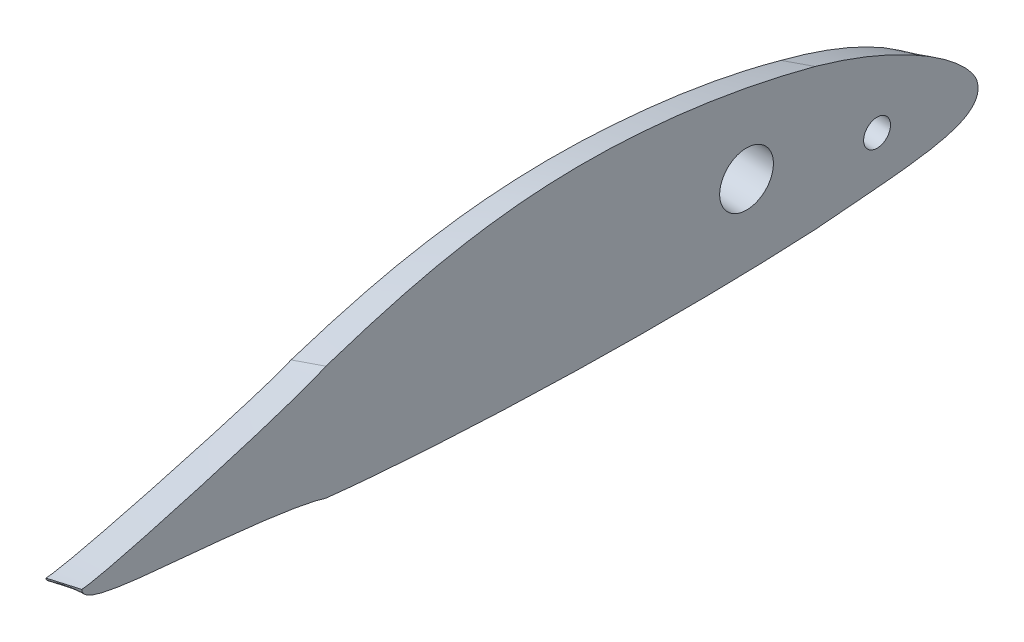
ISO-10303-21;
HEADER;
FILE_DESCRIPTION(('STEP AP214'),'2;1');
FILE_NAME('part.step','',(''),(''),'','','');
FILE_SCHEMA(('AUTOMOTIVE_DESIGN { 1 0 10303 214 1 1 1 1 }'));
ENDSEC;
DATA;
#1=APPLICATION_CONTEXT('core data for automotive mechanical design processes');
#2=APPLICATION_PROTOCOL_DEFINITION('international standard','automotive_design',2000,#1);
#3=PRODUCT_CONTEXT('',#1,'mechanical');
#4=PRODUCT('Part','Part','',(#3));
#5=PRODUCT_RELATED_PRODUCT_CATEGORY('part','',(#4));
#6=PRODUCT_DEFINITION_FORMATION('','',#4);
#7=PRODUCT_DEFINITION_CONTEXT('part definition',#1,'design');
#8=PRODUCT_DEFINITION('design','',#6,#7);
#9=PRODUCT_DEFINITION_SHAPE('','',#8);
#10=(LENGTH_UNIT() NAMED_UNIT(*) SI_UNIT(.MILLI.,.METRE.));
#11=(NAMED_UNIT(*) PLANE_ANGLE_UNIT() SI_UNIT($,.RADIAN.));
#12=(NAMED_UNIT(*) SI_UNIT($,.STERADIAN.) SOLID_ANGLE_UNIT());
#13=UNCERTAINTY_MEASURE_WITH_UNIT(LENGTH_MEASURE(1.E-05),#10,'distance_accuracy_value','');
#14=(GEOMETRIC_REPRESENTATION_CONTEXT(3) GLOBAL_UNCERTAINTY_ASSIGNED_CONTEXT((#13)) GLOBAL_UNIT_ASSIGNED_CONTEXT((#10,
#11,#12)) REPRESENTATION_CONTEXT('',''));
#15=CARTESIAN_POINT('',(0.,0.,0.));
#16=DIRECTION('',(0.,0.,1.));
#17=DIRECTION('',(1.,0.,0.));
#18=AXIS2_PLACEMENT_3D('',#15,#16,#17);
#19=CARTESIAN_POINT('',(-25.,-6.87523890885718,62.5215420335683));
#20=DIRECTION('',(1.,0.,0.));
#21=DIRECTION('',(0.,1.,0.));
#22=AXIS2_PLACEMENT_3D('',#19,#20,#21);
#23=PLANE('',#22);
#24=CARTESIAN_POINT('',(-24.9999999999996,1.64402232390111,15.5000000003833));
#25=DIRECTION('',(1.,0.,0.));
#26=DIRECTION('',(0.,1.,-1.19463882276146E-09));
#27=AXIS2_PLACEMENT_3D('',#24,#25,#26);
#28=ELLIPSE('',#27,2.06282703277914,2.06);
#29=CARTESIAN_POINT('',(-24.9999999999994,3.70684935668025,15.499999997919));
#30=VERTEX_POINT('',#29);
#31=EDGE_CURVE('E450',#30,#30,#28,.T.);
#32=ORIENTED_EDGE('',*,*,#31,.F.);
#33=EDGE_LOOP('',(#32));
#34=FACE_BOUND('',#33,.T.);
#35=CARTESIAN_POINT('',(-24.9999999999992,5.5006500499004,35.5100000003707));
#36=DIRECTION('',(1.,0.,0.));
#37=DIRECTION('',(0.,1.,-1.19463882276146E-09));
#38=AXIS2_PLACEMENT_3D('',#35,#36,#37);
#39=ELLIPSE('',#38,4.12565406555827,4.12);
#40=CARTESIAN_POINT('',(-24.9999999999989,9.62630411545868,35.5099999954421));
#41=VERTEX_POINT('',#40);
#42=EDGE_CURVE('E455',#41,#41,#39,.T.);
#43=ORIENTED_EDGE('',*,*,#42,.F.);
#44=EDGE_LOOP('',(#43));
#45=FACE_BOUND('',#44,.T.);
#46=CARTESIAN_POINT('',(-25.,-6.46727104194618,25.));
#47=CARTESIAN_POINT('',(-25.,-6.59514844057958,27.3335150436203));
#48=CARTESIAN_POINT('',(-25.,-6.76161802996523,31.2464802203529));
#49=CARTESIAN_POINT('',(-25.,-6.9275552680851,36.7458923067943));
#50=CARTESIAN_POINT('',(-25.,-7.01719182140762,42.1938583789044));
#51=CARTESIAN_POINT('',(-25.,-7.0464676153504,47.6734408847487));
#52=CARTESIAN_POINT('',(-25.,-7.03392510715627,56.2754783893999));
#53=CARTESIAN_POINT('',(-25.,-6.83729861053213,64.8634462694053));
#54=CARTESIAN_POINT('',(-25.,-6.43471319589367,75.7992808146063));
#55=CARTESIAN_POINT('',(-25.,-6.00320909266925,83.6044279292734));
#56=CARTESIAN_POINT('',(-25.,-5.40497674782844,92.1925983053741));
#57=CARTESIAN_POINT('',(-25.,-4.98326213169716,96.879208298821));
#58=CARTESIAN_POINT('',(-25.,-4.63536817981115,100.));
#59=B_SPLINE_CURVE_WITH_KNOTS('',3,(#46,#47,#48,#49,#50,#51,#52,#53,#54,#55,#56,#57,#58),
.UNSPECIFIED.,.F.,.F.,(4,1,1,1,1,1,1,1,1,1,4),(0.,0.09375,0.15625,0.21875,0.3125,0.375,0.5625,
0.65625,0.8125,0.875,1.),.UNSPECIFIED.);
#60=CARTESIAN_POINT('',(-25.,-6.46727104194618,25.));
#61=VERTEX_POINT('',#60);
#62=CARTESIAN_POINT('',(-25.,-4.63536817981115,100.));
#63=VERTEX_POINT('',#62);
#64=EDGE_CURVE('E208',#61,#63,#59,.T.);
#65=ORIENTED_EDGE('',*,*,#64,.F.);
#66=CARTESIAN_POINT('',(-25.,0.973605234190688,0.209986371700588));
#67=CARTESIAN_POINT('',(-25.,-5.02445676994703,-1.6030878994067));
#68=CARTESIAN_POINT('',(-25.,-5.12526387130145,10.1105981250928));
#69=CARTESIAN_POINT('',(-25.,-6.46727104194618,25.));
#70=B_SPLINE_CURVE_WITH_KNOTS('',3,(#66,#67,#68,#69),.UNSPECIFIED.,.F.,.F.,(4,4),(0.,1.),.UNSPECIFIED.);
#71=CARTESIAN_POINT('',(-25.,0.973605234190688,0.209986371700588));
#72=VERTEX_POINT('',#71);
#73=EDGE_CURVE('E13',#72,#61,#70,.T.);
#74=ORIENTED_EDGE('',*,*,#73,.F.);
#75=CARTESIAN_POINT('',(-25.,15.1870413329445,25.));
#76=CARTESIAN_POINT('',(-25.,11.2505460282975,10.9514941148119));
#77=CARTESIAN_POINT('',(-25.,4.68854762700634,1.64521557231438));
#78=CARTESIAN_POINT('',(-25.,0.973605234190688,0.209986371700588));
#79=B_SPLINE_CURVE_WITH_KNOTS('',3,(#75,#76,#77,#78),.UNSPECIFIED.,.F.,.F.,(4,4),(0.,1.),.UNSPECIFIED.);
#80=CARTESIAN_POINT('',(-25.,15.1870413329445,25.));
#81=VERTEX_POINT('',#80);
#82=EDGE_CURVE('E156',#81,#72,#79,.T.);
#83=ORIENTED_EDGE('',*,*,#82,.F.);
#84=CARTESIAN_POINT('',(-25.,12.8904914199755,100.));
#85=CARTESIAN_POINT('',(-25.,13.9017198457086,96.9217701257834));
#86=CARTESIAN_POINT('',(-25.,15.3529910442084,92.2723434802091));
#87=CARTESIAN_POINT('',(-25.,17.5611954251861,83.9333529161477));
#88=CARTESIAN_POINT('',(-25.,18.6223359111329,78.4097667119618));
#89=CARTESIAN_POINT('',(-25.,19.4717543578297,72.1307352650264));
#90=CARTESIAN_POINT('',(-25.,20.1811537589977,64.8415809888238));
#91=CARTESIAN_POINT('',(-25.,20.1301122581371,56.8127468678325));
#92=CARTESIAN_POINT('',(-25.,19.6578895305848,50.5374588378752));
#93=CARTESIAN_POINT('',(-25.,19.2942750671242,46.6091887363925));
#94=CARTESIAN_POINT('',(-25.,18.7483182972898,42.1560687549081));
#95=CARTESIAN_POINT('',(-25.,17.8299711544026,36.6680529799144));
#96=CARTESIAN_POINT('',(-25.,16.7438634166486,31.1887225621732));
#97=CARTESIAN_POINT('',(-25.,15.8028667331017,27.3087481175205));
#98=CARTESIAN_POINT('',(-25.,15.1870413329445,25.));
#99=B_SPLINE_CURVE_WITH_KNOTS('',3,(#84,#85,#86,#87,#88,#89,#90,#91,#92,#93,#94,#95,#96,#97,
#98),.UNSPECIFIED.,.F.,.F.,(4,1,1,1,1,1,1,1,1,1,1,1,4),(0.,0.125,0.1875,0.333569716721123,
0.34375,0.4375,0.625,0.666941593847408,0.6875,0.78125,0.84375,0.90625,1.),.UNSPECIFIED.);
#100=CARTESIAN_POINT('',(-25.,12.8904914199755,100.));
#101=VERTEX_POINT('',#100);
#102=EDGE_CURVE('E492',#101,#81,#99,.T.);
#103=ORIENTED_EDGE('',*,*,#102,.F.);
#104=CARTESIAN_POINT('',(-25.,1.96131753405757,137.419360993401));
#105=CARTESIAN_POINT('',(-25.,2.17769518252344,133.342560592737));
#106=CARTESIAN_POINT('',(-25.,10.5653288693064,104.537660694706));
#107=CARTESIAN_POINT('',(-25.,12.8904914199755,100.));
#108=B_SPLINE_CURVE_WITH_KNOTS('',3,(#104,#105,#106,#107),.UNSPECIFIED.,.F.,.F.,(4,4),(0.,1.),.UNSPECIFIED.);
#109=CARTESIAN_POINT('',(-25.,1.96131753405757,137.419360993401));
#110=VERTEX_POINT('',#109);
#111=EDGE_CURVE('E326',#110,#101,#108,.T.);
#112=ORIENTED_EDGE('',*,*,#111,.F.);
#113=CARTESIAN_POINT('',(-25.,-4.63536817981115,100.));
#114=CARTESIAN_POINT('',(-25.,-4.12984221570328,101.448294677224));
#115=CARTESIAN_POINT('',(-25.,-2.96356299158403,107.679495801348));
#116=CARTESIAN_POINT('',(-25.,-1.62946195542815,121.235381181294));
#117=CARTESIAN_POINT('',(-25.,-0.557970232798628,133.508903021512));
#118=CARTESIAN_POINT('',(-25.,0.772229147088015,137.377579987367));
#119=CARTESIAN_POINT('',(-25.,1.96131753405757,137.419360993401));
#120=B_SPLINE_CURVE_WITH_KNOTS('',3,(#113,#114,#115,#116,#117,#118,#119),.UNSPECIFIED.,.F.,.F.,
(4,1,1,1,4),(0.,0.25,0.5,0.75,1.),.UNSPECIFIED.);
#121=EDGE_CURVE('E381',#63,#110,#120,.T.);
#122=ORIENTED_EDGE('',*,*,#121,.F.);
#123=EDGE_LOOP('',(#65,#74,#83,#103,#112,#122));
#124=FACE_BOUND('',#123,.T.);
#125=ADVANCED_FACE('F146',(#34,#45,#124),#23,.T.);
#126=CARTESIAN_POINT('',(-30.9940646990496,-1.37215374510614,118.708278387877));
#127=DIRECTION('',(-0.998629534743233,0.0523359564593458,-6.25186067476628E-11));
#128=DIRECTION('',(-0.0523359564593458,-0.998629534743233,0.));
#129=AXIS2_PLACEMENT_3D('',#126,#127,#128);
#130=PLANE('',#129);
#131=CARTESIAN_POINT('',(-30.8200085103059,1.94903604659932,15.500000000019));
#132=DIRECTION('',(-0.998629534743233,0.0523359564593458,-6.25186067476628E-11));
#133=DIRECTION('',(-0.0523359564593458,-0.998629534743233,0.));
#134=AXIS2_PLACEMENT_3D('',#131,#132,#133);
#135=CIRCLE('',#134,2.06);
#136=CARTESIAN_POINT('',(-30.9278205806121,-0.108140794971745,15.500000000019));
#137=VERTEX_POINT('',#136);
#138=EDGE_CURVE('E150',#137,#137,#135,.T.);
#139=ORIENTED_EDGE('',*,*,#138,.F.);
#140=EDGE_LOOP('',(#139));
#141=FACE_BOUND('',#140,.T.);
#142=CARTESIAN_POINT('',(-30.618444825927,5.79510026747242,35.510000000019));
#143=DIRECTION('',(-0.998629534743233,0.0523359564593458,-6.25186067476628E-11));
#144=DIRECTION('',(-0.0523359564593458,-0.998629534743233,0.));
#145=AXIS2_PLACEMENT_3D('',#142,#143,#144);
#146=CIRCLE('',#145,4.12);
#147=CARTESIAN_POINT('',(-30.8340689665395,1.6807465843303,35.510000000019));
#148=VERTEX_POINT('',#147);
#149=EDGE_CURVE('E458',#148,#148,#146,.T.);
#150=ORIENTED_EDGE('',*,*,#149,.F.);
#151=EDGE_LOOP('',(#150));
#152=FACE_BOUND('',#151,.T.);
#153=CARTESIAN_POINT('',(-31.0430922171337,-2.30765453758993,100.));
#154=CARTESIAN_POINT('',(-31.0405888672822,-2.25988777663054,100.387571370376));
#155=CARTESIAN_POINT('',(-31.0385119866042,-2.22025853223121,100.775962419935));
#156=CARTESIAN_POINT('',(-31.034612804975,-2.14585771397358,101.55323382453));
#157=CARTESIAN_POINT('',(-31.0328238002538,-2.11172147003079,101.942205345746));
#158=CARTESIAN_POINT('',(-31.0277548977915,-2.01500104829763,103.109449228744));
#159=CARTESIAN_POINT('',(-31.0247728156235,-1.95809953014157,103.888077041598));
#160=CARTESIAN_POINT('',(-31.0166047235201,-1.8022430460934,106.224871932533));
#161=CARTESIAN_POINT('',(-31.0122264000537,-1.71869965605326,107.783985053902));
#162=CARTESIAN_POINT('',(-31.0015555983983,-1.51508862635474,112.46421069925));
#163=CARTESIAN_POINT('',(-30.9972648556404,-1.43321637391091,115.586080001787));
#164=CARTESIAN_POINT('',(-30.9924646207543,-1.34162243070374,120.269377580922));
#165=CARTESIAN_POINT('',(-30.9912460999377,-1.3183716666778,121.830656945481));
#166=CARTESIAN_POINT('',(-30.9888938329408,-1.2734877350425,124.953255705198));
#167=CARTESIAN_POINT('',(-30.9877497450413,-1.25165723567519,126.514580261228));
#168=CARTESIAN_POINT('',(-30.9848488152157,-1.19630419458495,128.856133164177));
#169=CARTESIAN_POINT('',(-30.9836803499547,-1.17400854838672,129.636527523433));
#170=CARTESIAN_POINT('',(-30.9804898397006,-1.11312998451311,131.196794003637));
#171=CARTESIAN_POINT('',(-30.9785047780215,-1.07525275050715,131.976670930877));
#172=CARTESIAN_POINT('',(-30.9740763386401,-0.990753092312241,133.144754822464));
#173=CARTESIAN_POINT('',(-30.9723496098295,-0.957805143526188,133.533773789068));
#174=CARTESIAN_POINT('',(-30.9679703995469,-0.874244832958121,134.30995257949));
#175=CARTESIAN_POINT('',(-30.9653447538219,-0.824144527732533,134.697344223543));
#176=CARTESIAN_POINT('',(-30.9599479999923,-0.721168329976943,135.27376736968));
#177=CARTESIAN_POINT('',(-30.9579009353132,-0.682108008959784,135.465171861675));
#178=CARTESIAN_POINT('',(-30.9529733893552,-0.588084830937332,135.843918077059));
#179=CARTESIAN_POINT('',(-30.9501052741016,-0.53335793174868,136.03184311131));
#180=CARTESIAN_POINT('',(-30.9427770696627,-0.393527461320893,136.395083969518));
#181=CARTESIAN_POINT('',(-30.9383638609231,-0.309318422264135,136.574153668947));
#182=CARTESIAN_POINT('',(-30.9287325263111,-0.125541610533196,136.803263628492));
#183=CARTESIAN_POINT('',(-30.9250229121406,-0.0547579556999206,136.871643763586));
#184=CARTESIAN_POINT('',(-30.9161452343838,0.114638226466441,136.971573672684));
#185=CARTESIAN_POINT('',(-30.9111027596621,0.210854375510566,136.999166459119));
#186=CARTESIAN_POINT('',(-30.9059320818603,0.309516785006777,137.));
#187=B_SPLINE_CURVE_WITH_KNOTS('',3,(#153,#154,#155,#156,#157,#158,#159,#160,#161,#162,#163,
#164,#165,#166,#167,#168,#169,#170,#171,#172,#173,#174,#175,#176,#177,#178,#179,#180,#181,#182,
#183,#184,#185,#186),.UNSPECIFIED.,.F.,.F.,(4,2,2,2,2,2,2,2,2,2,2,2,2,2,2,2,4),(0.,
0.0312499999999995,0.0624999999999991,0.124999999999999,0.250000000000001,0.500000000000004,
0.625000000000004,0.750000000000005,0.812500000000005,0.875000000000004,0.906250000000004,
0.937500000000003,0.953125000000002,0.968750000000001,0.984374999999999,0.9921875,1.),.UNSPECIFIED.);
#188=CARTESIAN_POINT('',(-31.0430922171337,-2.30765453758993,100.));
#189=VERTEX_POINT('',#188);
#190=CARTESIAN_POINT('',(-30.9059320818603,0.309516785006768,137.));
#191=VERTEX_POINT('',#190);
#192=EDGE_CURVE('E293',#189,#191,#187,.T.);
#193=ORIENTED_EDGE('',*,*,#192,.T.);
#194=CARTESIAN_POINT('',(-30.9059320818603,0.309516785006768,137.));
#195=CARTESIAN_POINT('',(-30.9055368501271,0.317058255456844,136.796608319332));
#196=CARTESIAN_POINT('',(-30.9043057559796,0.340548930824258,136.596440665329));
#197=CARTESIAN_POINT('',(-30.9014926531859,0.39422612904938,136.197458878768));
#198=CARTESIAN_POINT('',(-30.8998336058368,0.425882637920563,135.998941894195));
#199=CARTESIAN_POINT('',(-30.8944844793777,0.527950049914961,135.404825731228));
#200=CARTESIAN_POINT('',(-30.8904204599391,0.605496159532625,135.010668887805));
#201=CARTESIAN_POINT('',(-30.8775924361851,0.850269431795186,133.830651356376));
#202=CARTESIAN_POINT('',(-30.8681676103681,1.03010581978635,133.047339540177));
#203=CARTESIAN_POINT('',(-30.8388545300934,1.58943270613084,130.701410113554));
#204=CARTESIAN_POINT('',(-30.8178634755727,1.98996588314187,129.143572852775));
#205=CARTESIAN_POINT('',(-30.7531377685201,3.22500593594318,124.481867583631));
#206=CARTESIAN_POINT('',(-30.7074997192882,4.09583178419868,121.387728801896));
#207=CARTESIAN_POINT('',(-30.6131804816859,5.89555003435182,115.216167771568));
#208=CARTESIAN_POINT('',(-30.5644926472979,6.82456924981885,112.138782030795));
#209=CARTESIAN_POINT('',(-30.4878047427749,8.28786162677363,107.54278735239));
#210=CARTESIAN_POINT('',(-30.4616586015277,8.78675971787766,106.014270614859));
#211=CARTESIAN_POINT('',(-30.4204658759082,9.57276373998781,103.735527854569));
#212=CARTESIAN_POINT('',(-30.4064161236507,9.84084898122943,102.978155452533));
#213=CARTESIAN_POINT('',(-30.3842197287804,10.2643814226241,101.849866930561));
#214=CARTESIAN_POINT('',(-30.3766359577625,10.4090883929775,101.475051997465));
#215=CARTESIAN_POINT('',(-30.3606868702697,10.7134151093236,100.730835621208));
#216=CARTESIAN_POINT('',(-30.3524890229688,10.8698393531269,100.360274178101));
#217=CARTESIAN_POINT('',(-30.3428060033805,11.0546023722461,100.));
#218=B_SPLINE_CURVE_WITH_KNOTS('',3,(#194,#195,#196,#197,#198,#199,#200,#201,#202,#203,#204,
#205,#206,#207,#208,#209,#210,#211,#212,#213,#214,#215,#216,#217),.UNSPECIFIED.,.F.,.F.,(4,2,2,
2,2,2,2,2,2,2,2,4),(0.,0.015624999999999,0.0312499999999979,0.062499999999998,0.124999999999998,
0.249999999999998,0.499999999999999,0.75,0.875,0.9375,0.96875,1.),.UNSPECIFIED.);
#219=CARTESIAN_POINT('',(-30.3428060033805,11.0546023722461,100.));
#220=VERTEX_POINT('',#219);
#221=EDGE_CURVE('E284',#191,#220,#218,.T.);
#222=ORIENTED_EDGE('',*,*,#221,.T.);
#223=CARTESIAN_POINT('',(-30.3428060033805,11.0546023722461,100.));
#224=CARTESIAN_POINT('',(-30.2868563612065,12.1221851341158,96.9322533281964));
#225=CARTESIAN_POINT('',(-30.2085072298683,13.6171756068156,92.291985137274));
#226=CARTESIAN_POINT('',(-30.0884420444621,15.9081558012432,83.6971849551633));
#227=CARTESIAN_POINT('',(-30.0125122894403,17.3569818200314,75.7804617281611));
#228=CARTESIAN_POINT('',(-29.9577725554591,18.4014781489858,64.8361954549192));
#229=CARTESIAN_POINT('',(-29.9600220398568,18.3585554197134,56.3085673557943));
#230=CARTESIAN_POINT('',(-29.9955000995849,17.681593705108,47.6635880941875));
#231=CARTESIAN_POINT('',(-30.0292408966741,17.0377809399741,42.1467609712499));
#232=CARTESIAN_POINT('',(-30.0767030750949,16.1321486232158,36.6488807432505));
#233=CARTESIAN_POINT('',(-30.1344380159256,15.0305003235926,31.1744965464025));
#234=CARTESIAN_POINT('',(-30.1861922586034,14.0429705443545,27.302647893024));
#235=CARTESIAN_POINT('',(-30.220952153661,13.3797122355054,25.));
#236=B_SPLINE_CURVE_WITH_KNOTS('',3,(#223,#224,#225,#226,#227,#228,#229,#230,#231,#232,#233,
#234,#235),.UNSPECIFIED.,.F.,.F.,(4,1,1,1,1,1,1,1,1,1,4),(0.,0.125,0.1875,0.34375,0.4375,0.625,
0.6875,0.78125,0.84375,0.90625,1.),.UNSPECIFIED.);
#237=CARTESIAN_POINT('',(-30.2209521536492,13.3797122357301,25.));
#238=VERTEX_POINT('',#237);
#239=EDGE_CURVE('E292',#220,#238,#236,.T.);
#240=ORIENTED_EDGE('',*,*,#239,.T.);
#241=CARTESIAN_POINT('',(-30.2209521536492,13.3797122357301,25.));
#242=CARTESIAN_POINT('',(-30.2360665330655,13.0913126960277,23.9069928281534));
#243=CARTESIAN_POINT('',(-30.2524284480114,12.7791087604684,22.8211768855777));
#244=CARTESIAN_POINT('',(-30.2877608647862,12.1049260866965,20.6645818038492));
#245=CARTESIAN_POINT('',(-30.3067483404637,11.7426234681599,19.5929433795812));
#246=CARTESIAN_POINT('',(-30.3676913101732,10.5797623339953,16.4131151733036));
#247=CARTESIAN_POINT('',(-30.4135499291072,9.70472775894772,14.3366321597632));
#248=CARTESIAN_POINT('',(-30.492321691831,8.20167298988506,11.3047614109054));
#249=CARTESIAN_POINT('',(-30.5203217083668,7.66740084812574,10.3061142655404));
#250=CARTESIAN_POINT('',(-30.5801952829931,6.52494498910318,8.35719655750463));
#251=CARTESIAN_POINT('',(-30.6120326179864,5.91745244970262,7.40606845319041));
#252=CARTESIAN_POINT('',(-30.6639449580099,4.9269059963922,6.03039867920954));
#253=CARTESIAN_POINT('',(-30.6819796517282,4.58278354131777,5.5798333875021));
#254=CARTESIAN_POINT('',(-30.7196749026293,3.86351530833346,4.70815223459664));
#255=CARTESIAN_POINT('',(-30.7393383710088,3.48831398147862,4.28621424960424));
#256=CARTESIAN_POINT('',(-30.781148086248,2.69053709247026,3.48464673590407));
#257=CARTESIAN_POINT('',(-30.8032705125884,2.26841605289779,3.10390672120265));
#258=CARTESIAN_POINT('',(-30.839094100368,1.58486128006569,2.60530784838879));
#259=CARTESIAN_POINT('',(-30.8515476253812,1.34723386784442,2.45039955633066));
#260=CARTESIAN_POINT('',(-30.8778128767139,0.846063018781732,2.18234874389511));
#261=CARTESIAN_POINT('',(-30.8914153320993,0.586512709223841,2.07004208892214));
#262=CARTESIAN_POINT('',(-30.9059320734379,0.309516784545213,2.00000000001898));
#263=B_SPLINE_CURVE_WITH_KNOTS('',3,(#241,#242,#243,#244,#245,#246,#247,#248,#249,#250,#251,
#252,#253,#254,#255,#256,#257,#258,#259,#260,#261,#262),.UNSPECIFIED.,.F.,.F.,(4,2,2,2,2,2,2,2,
2,2,4),(0.,0.125,0.25,0.5,0.625,0.75,0.8125,0.875,0.9375,0.96875,1.),.UNSPECIFIED.);
#264=CARTESIAN_POINT('',(-30.9059320734379,0.309516784545213,2.00000000001898));
#265=VERTEX_POINT('',#264);
#266=EDGE_CURVE('E229',#238,#265,#263,.T.);
#267=ORIENTED_EDGE('',*,*,#266,.T.);
#268=CARTESIAN_POINT('',(-30.9059320734365,0.309516784571313,2.00000000001346));
#269=CARTESIAN_POINT('',(-30.9125017860627,0.184159200503921,2.0265097236331));
#270=CARTESIAN_POINT('',(-30.9187234124713,0.0654434971226595,2.06913990747394));
#271=CARTESIAN_POINT('',(-30.9305749653615,-0.160697602466682,2.18180289730611));
#272=CARTESIAN_POINT('',(-30.9362270269369,-0.26854536142169,2.2525171177577));
#273=CARTESIAN_POINT('',(-30.9517661779802,-0.565050024983014,2.48814850985323));
#274=CARTESIAN_POINT('',(-30.9606563100254,-0.734683848776912,2.68035349366256));
#275=CARTESIAN_POINT('',(-30.9762130822765,-1.03152474480303,3.08882119932063));
#276=CARTESIAN_POINT('',(-30.9829066167109,-1.15924498948343,3.30533768641629));
#277=CARTESIAN_POINT('',(-30.9950377099369,-1.39072003600797,3.75259075133175));
#278=CARTESIAN_POINT('',(-31.0004738819693,-1.49444837691044,3.98435917167242));
#279=CARTESIAN_POINT('',(-31.0153031264911,-1.77740721659793,4.68476750698042));
#280=CARTESIAN_POINT('',(-31.0233416414315,-1.93079121773895,5.16072604035349));
#281=CARTESIAN_POINT('',(-31.0375696873338,-2.20227850412898,6.12166927173714));
#282=CARTESIAN_POINT('',(-31.0437131767197,-2.31950326377605,6.60687873040012));
#283=CARTESIAN_POINT('',(-31.060344861304,-2.63685470761402,8.07128820826406));
#284=CARTESIAN_POINT('',(-31.0690815234247,-2.80356014986264,9.06047441358479));
#285=CARTESIAN_POINT('',(-31.084159506197,-3.09126519655822,11.0428311861838));
#286=CARTESIAN_POINT('',(-31.0904481467589,-3.21125960501708,12.0360067257797));
#287=CARTESIAN_POINT('',(-31.107091196657,-3.52882791014887,15.0190838806501));
#288=CARTESIAN_POINT('',(-31.1152719917049,-3.68492677564576,17.0124573542679));
#289=CARTESIAN_POINT('',(-31.1290043791062,-3.94695633084847,21.0034038595205));
#290=CARTESIAN_POINT('',(-31.1344768488934,-4.05137727206037,23.0011032715973));
#291=CARTESIAN_POINT('',(-31.1391997190062,-4.14149499948288,25.0000000000077));
#292=B_SPLINE_CURVE_WITH_KNOTS('',3,(#268,#269,#270,#271,#272,#273,#274,#275,#276,#277,#278,
#279,#280,#281,#282,#283,#284,#285,#286,#287,#288,#289,#290,#291),.UNSPECIFIED.,.F.,.F.,(4,2,2,
2,2,2,2,2,2,2,2,4),(0.,0.015625,0.0312500000000001,0.0625000000000001,0.0937500000000002,0.125,
0.1875,0.25,0.375,0.5,0.75,1.),.UNSPECIFIED.);
#293=CARTESIAN_POINT('',(-31.1391997190062,-4.14149499948288,25.0000000000077));
#294=VERTEX_POINT('',#293);
#295=EDGE_CURVE('E203',#265,#294,#292,.T.);
#296=ORIENTED_EDGE('',*,*,#295,.T.);
#297=CARTESIAN_POINT('',(-31.1391997190151,-4.14149499965263,25.));
#298=CARTESIAN_POINT('',(-31.1430430044371,-4.21482925103832,27.325305096942));
#299=CARTESIAN_POINT('',(-31.1493019262991,-4.33425658945246,31.2273342313834));
#300=CARTESIAN_POINT('',(-31.1579651030278,-4.4995598415217,36.7200894792421));
#301=CARTESIAN_POINT('',(-31.1645137064708,-4.62451463189443,42.1813315600029));
#302=CARTESIAN_POINT('',(-31.1681694759834,-4.69427086407652,46.6183041293754));
#303=CARTESIAN_POINT('',(-31.1696969766129,-4.72341730758226,50.5350843338448));
#304=CARTESIAN_POINT('',(-31.170381284993,-4.73647468178917,56.7969338044924));
#305=CARTESIAN_POINT('',(-31.1614114671015,-4.56532035162532,64.85619818432));
#306=CARTESIAN_POINT('',(-31.1456188094465,-4.26397848479534,72.142339747397));
#307=CARTESIAN_POINT('',(-31.128822439987,-3.94348465713868,78.3999568276506));
#308=CARTESIAN_POINT('',(-31.10984505844,-3.58137464081677,83.8834932107559));
#309=CARTESIAN_POINT('',(-31.0784467136676,-2.98225852497507,92.219032899259));
#310=CARTESIAN_POINT('',(-31.0581773167011,-2.59549538690137,96.8933170472572));
#311=CARTESIAN_POINT('',(-31.0430922171337,-2.30765453758993,100.));
#312=B_SPLINE_CURVE_WITH_KNOTS('',3,(#297,#298,#299,#300,#301,#302,#303,#304,#305,#306,#307,
#308,#309,#310,#311),.UNSPECIFIED.,.F.,.F.,(4,1,1,1,1,1,1,1,1,1,1,1,4),(0.,0.09375,0.15625,
0.21875,0.3125,0.333058406152592,0.375,0.5625,0.65625,0.666430283278877,0.8125,0.875,1.),.UNSPECIFIED.);
#313=EDGE_CURVE('E212',#294,#189,#312,.T.);
#314=ORIENTED_EDGE('',*,*,#313,.T.);
#315=EDGE_LOOP('',(#193,#222,#240,#267,#296,#314));
#316=FACE_BOUND('',#315,.T.);
#317=ADVANCED_FACE('F227',(#141,#152,#316),#130,.T.);
#318=CARTESIAN_POINT('',(-30.9059320734379,0.309516784545213,2.00000000001898));
#319=CARTESIAN_POINT('',(-25.,0.973605234190688,0.209986371700588));
#320=CARTESIAN_POINT('',(-30.8914153320993,0.586512709223841,2.07004208892214));
#321=CARTESIAN_POINT('',(-25.,1.08969718396618,0.254837284219769));
#322=CARTESIAN_POINT('',(-30.8778128767139,0.846063018781732,2.18234874389511));
#323=CARTESIAN_POINT('',(-25.,1.20856946187494,0.307374768361883));
#324=CARTESIAN_POINT('',(-30.8515476253812,1.34723386784442,2.45039955633066));
#325=CARTESIAN_POINT('',(-25.,1.45154065545896,0.427631911752379));
#326=CARTESIAN_POINT('',(-30.839094100368,1.58486128006569,2.60530784838879));
#327=CARTESIAN_POINT('',(-25.,1.57563957113421,0.495351571000761));
#328=CARTESIAN_POINT('',(-30.8032705125884,2.26841605289779,3.10390672120265));
#329=CARTESIAN_POINT('',(-25.,1.95527524705959,0.720997359195908));
#330=CARTESIAN_POINT('',(-30.781148086248,2.69053709247026,3.48464673590407));
#331=CARTESIAN_POINT('',(-25.,2.21815093620935,0.901410298592676));
#332=CARTESIAN_POINT('',(-30.7393383710088,3.48831398147862,4.28621424960424));
#333=CARTESIAN_POINT('',(-25.,2.76080064357398,1.32067326013609));
#334=CARTESIAN_POINT('',(-30.7196749026293,3.86351530833346,4.70815223459664));
#335=CARTESIAN_POINT('',(-25.,3.04057466178885,1.55952328228274));
#336=CARTESIAN_POINT('',(-30.6819796517282,4.58278354131777,5.5798333875021));
#337=CARTESIAN_POINT('',(-25.,3.61434887928318,2.09413266420912));
#338=CARTESIAN_POINT('',(-30.6639449580099,4.9269059963922,6.03039867920954));
#339=CARTESIAN_POINT('',(-25.,3.90834907856263,2.38989202398885));
#340=CARTESIAN_POINT('',(-30.6120326179864,5.91745244970262,7.40606845319041));
#341=CARTESIAN_POINT('',(-25.,4.80768072599702,3.36024249210249));
#342=CARTESIAN_POINT('',(-30.5801952829931,6.52494498910318,8.35719655750463));
#343=CARTESIAN_POINT('',(-25.,5.43034322374801,4.11790598921083));
#344=CARTESIAN_POINT('',(-30.5203217083668,7.66740084812574,10.3061142655404));
#345=CARTESIAN_POINT('',(-25.,6.70050716750172,5.84253739255835));
#346=CARTESIAN_POINT('',(-30.492321691831,8.20167298988506,11.3047614109054));
#347=CARTESIAN_POINT('',(-25.,7.34800861350445,6.80950529879751));
#348=CARTESIAN_POINT('',(-30.4135499291072,9.70472775894772,14.3366321597632));
#349=CARTESIAN_POINT('',(-25.,9.29570559788367,10.0060326898097));
#350=CARTESIAN_POINT('',(-30.3676913101732,10.5797623339953,16.4131151733036));
#351=CARTESIAN_POINT('',(-25.,10.6010937826312,12.5312158468775));
#352=CARTESIAN_POINT('',(-30.3067483404637,11.7426234681599,19.5929433795812));
#353=CARTESIAN_POINT('',(-25.,12.4412982484684,16.8369061614625));
#354=CARTESIAN_POINT('',(-30.2877608647862,12.1049260866965,20.6645818038492));
#355=CARTESIAN_POINT('',(-25.,13.0350534352001,18.358455529488));
#356=CARTESIAN_POINT('',(-30.2524284480114,12.7791087604684,22.8211768855777));
#357=CARTESIAN_POINT('',(-25.,14.1618940208977,21.5619708309325));
#358=CARTESIAN_POINT('',(-30.2360665330655,13.0913126960277,23.9069928281534));
#359=CARTESIAN_POINT('',(-25.,14.6949794198636,23.2439367643515));
#360=CARTESIAN_POINT('',(-30.2209521536492,13.3797122357301,25.));
#361=CARTESIAN_POINT('',(-25.,15.1870413329445,25.));
#362=B_SPLINE_SURFACE_WITH_KNOTS('',3,1,((#318,#319),(#320,#321),(#322,#323),(#324,#325),(#326,
#327),(#328,#329),(#330,#331),(#332,#333),(#334,#335),(#336,#337),(#338,#339),(#340,#341),(#342,
#343),(#344,#345),(#346,#347),(#348,#349),(#350,#351),(#352,#353),(#354,#355),(#356,#357),(#358,
#359),(#360,#361)),.UNSPECIFIED.,.F.,.F.,.F.,(4,2,2,2,2,2,2,2,2,2,4),(2,2),(0.,0.03125,0.0625,
0.125,0.1875,0.25,0.375,0.5,0.75,0.875,1.),(0.,1.),.UNSPECIFIED.);
#363=DIRECTION('',(0.944981797239758,0.32712291709007,0.));
#364=VECTOR('',#363,1.);
#365=CARTESIAN_POINT('',(-27.6104760768246,14.2833767843373,25.));
#366=LINE('',#365,#364);
#367=EDGE_CURVE('E317',#238,#81,#366,.T.);
#368=DIRECTION('',(-0.951515833977009,-0.106992540236089,0.288392465270621));
#369=VECTOR('',#368,1.);
#370=CARTESIAN_POINT('',(-27.952966036719,0.641561009367951,1.10499318585978));
#371=LINE('',#370,#369);
#372=EDGE_CURVE('E221',#72,#265,#371,.T.);
#373=ORIENTED_EDGE('',*,*,#266,.F.);
#374=ORIENTED_EDGE('',*,*,#367,.T.);
#375=ORIENTED_EDGE('',*,*,#82,.T.);
#376=ORIENTED_EDGE('',*,*,#372,.T.);
#377=EDGE_LOOP('',(#373,#374,#375,#376));
#378=FACE_BOUND('',#377,.T.);
#379=ADVANCED_FACE('F250',(#378),#362,.T.);
#380=CARTESIAN_POINT('',(-30.220952153661,13.3797122355054,25.));
#381=CARTESIAN_POINT('',(-25.,15.1870413329445,25.));
#382=CARTESIAN_POINT('',(-30.1861922586034,14.0429705443545,27.302647893024));
#383=CARTESIAN_POINT('',(-25.,15.8028667331017,27.3087481175205));
#384=CARTESIAN_POINT('',(-30.1344380159256,15.0305003235926,31.1744965464025));
#385=CARTESIAN_POINT('',(-25.,16.7438634166486,31.1887225621732));
#386=CARTESIAN_POINT('',(-30.0767030750949,16.1321486232158,36.6488807432505));
#387=CARTESIAN_POINT('',(-25.,17.8299711544026,36.6680529799144));
#388=CARTESIAN_POINT('',(-30.0292408966741,17.0377809399741,42.1467609712499));
#389=CARTESIAN_POINT('',(-25.,18.7483182972898,42.1560687549081));
#390=CARTESIAN_POINT('',(-30.0019693238482,17.5581535519239,46.6058302769687));
#391=CARTESIAN_POINT('',(-25.,19.2942750671242,46.6091887363925));
#392=CARTESIAN_POINT('',(-29.9837024546077,17.9067061840109,50.5383336959809));
#393=CARTESIAN_POINT('',(-25.,19.6578895305848,50.5374588378752));
#394=CARTESIAN_POINT('',(-29.95988750658,18.3611224681543,56.8185730051909));
#395=CARTESIAN_POINT('',(-25.,20.1301122581371,56.8127468678325));
#396=CARTESIAN_POINT('',(-29.9577725554591,18.4014781489858,64.8361954549192));
#397=CARTESIAN_POINT('',(-25.,20.1811537589977,64.8415809888238));
#398=CARTESIAN_POINT('',(-29.9942361353008,17.7057116094865,72.1264597298686));
#399=CARTESIAN_POINT('',(-25.,19.4717543578297,72.1307352650264));
#400=CARTESIAN_POINT('',(-30.0377647724762,16.8751357446571,78.4133810485541));
#401=CARTESIAN_POINT('',(-25.,18.6223359111329,78.4097667119618));
#402=CARTESIAN_POINT('',(-30.0919978192966,15.8403075761797,83.9517231386666));
#403=CARTESIAN_POINT('',(-25.,17.5611954251861,83.9333529161477));
#404=CARTESIAN_POINT('',(-30.2085072298683,13.6171756068156,92.291985137274));
#405=CARTESIAN_POINT('',(-25.,15.3529910442084,92.2723434802091));
#406=CARTESIAN_POINT('',(-30.2868563612065,12.1221851341158,96.9322533281964));
#407=CARTESIAN_POINT('',(-25.,13.9017198457086,96.9217701257834));
#408=CARTESIAN_POINT('',(-30.3428060033805,11.0546023722461,100.));
#409=CARTESIAN_POINT('',(-25.,12.8904914199755,100.));
#410=B_SPLINE_SURFACE_WITH_KNOTS('',3,1,((#380,#381),(#382,#383),(#384,#385),(#386,#387),(#388,
#389),(#390,#391),(#392,#393),(#394,#395),(#396,#397),(#398,#399),(#400,#401),(#402,#403),(#404,
#405),(#406,#407),(#408,#409)),.UNSPECIFIED.,.F.,.F.,.F.,(4,1,1,1,1,1,1,1,1,1,1,1,4),(2,2),(0.,
0.09375,0.15625,0.21875,0.3125,0.333058406152592,0.375,0.5625,0.65625,0.666430283278877,0.8125,
0.875,1.),(0.,1.),.UNSPECIFIED.);
#411=DIRECTION('',(0.945724712595379,0.324968872334548,0.));
#412=VECTOR('',#411,1.);
#413=CARTESIAN_POINT('',(-27.6714030016903,11.9725468961108,100.));
#414=LINE('',#413,#412);
#415=EDGE_CURVE('E315',#220,#101,#414,.T.);
#416=ORIENTED_EDGE('',*,*,#239,.F.);
#417=ORIENTED_EDGE('',*,*,#415,.T.);
#418=ORIENTED_EDGE('',*,*,#102,.T.);
#419=ORIENTED_EDGE('',*,*,#367,.F.);
#420=EDGE_LOOP('',(#416,#417,#418,#419));
#421=FACE_BOUND('',#420,.T.);
#422=ADVANCED_FACE('F313',(#421),#410,.T.);
#423=CARTESIAN_POINT('',(-31.1391997190062,-4.14149499948288,25.0000000000077));
#424=CARTESIAN_POINT('',(-25.,-6.46727104194618,25.));
#425=CARTESIAN_POINT('',(-31.1344768488934,-4.05137727206037,23.0011032715973));
#426=CARTESIAN_POINT('',(-25.,-6.25625812941599,22.6588381014781));
#427=CARTESIAN_POINT('',(-31.1290043791062,-3.94695633084847,21.0034038595205));
#428=CARTESIAN_POINT('',(-25.,-6.07031444186612,20.3155097300161));
#429=CARTESIAN_POINT('',(-31.1218191333373,-3.80985367725744,18.9152067636369));
#430=CARTESIAN_POINT('',(-25.0000000000001,-5.86773446867523,17.8638320698492));
#431=CARTESIAN_POINT('',(-31.1150173339879,-3.68006761702593,16.9559751198696));
#432=CARTESIAN_POINT('',(-25.0000000000001,-5.67730776307613,15.5634791363704));
#433=CARTESIAN_POINT('',(-31.1067262665243,-3.52186462850043,14.9627777815527));
#434=CARTESIAN_POINT('',(-25.0000000000001,-5.47437307578013,13.2213166012225));
#435=CARTESIAN_POINT('',(-31.0961968104341,-3.32095064069191,13.0663892209089));
#436=CARTESIAN_POINT('',(-25.0000000000001,-5.21528004238924,10.9943218845444));
#437=CARTESIAN_POINT('',(-31.0904481467589,-3.21125960501708,12.0360067257797));
#438=CARTESIAN_POINT('',(-25.0000000000001,-5.07378094992987,9.78433085284814));
#439=CARTESIAN_POINT('',(-31.084159506197,-3.09126519655822,11.0428311861838));
#440=CARTESIAN_POINT('',(-25.0000000000001,-4.91811103453904,8.61861646689018));
#441=CARTESIAN_POINT('',(-31.0725834950473,-2.87038174824309,9.52089125238124));
#442=CARTESIAN_POINT('',(-25.0000000000001,-4.60379405286719,6.84155073261075));
#443=CARTESIAN_POINT('',(-31.0644031684774,-2.71429182064151,8.53077964989564));
#444=CARTESIAN_POINT('',(-25.0000000000001,-4.3728360369825,5.68870802416582));
#445=CARTESIAN_POINT('',(-31.0544075118692,-2.52356333257868,7.54850828530049));
#446=CARTESIAN_POINT('',(-25.0000000000001,-4.07682722635806,4.54768001673797));
#447=CARTESIAN_POINT('',(-31.0439943433472,-2.32486824257679,6.63163527698877));
#448=CARTESIAN_POINT('',(-25.,-3.74233456632578,3.49605967780861));
#449=CARTESIAN_POINT('',(-31.0378812632629,-2.20822372696606,6.14627736957497));
#450=CARTESIAN_POINT('',(-25.,-3.53352034532391,2.94705565487789));
#451=CARTESIAN_POINT('',(-31.0308164623219,-2.07341929567234,5.66556546734031));
#452=CARTESIAN_POINT('',(-25.,-3.27586815181277,2.41818674195317));
#453=CARTESIAN_POINT('',(-31.0244316913616,-1.95159060927774,5.23434655784388));
#454=CARTESIAN_POINT('',(-25.,-3.04228475054927,1.94458795304574));
#455=CARTESIAN_POINT('',(-31.0165348321953,-1.80090956131498,4.75769650504503));
#456=CARTESIAN_POINT('',(-25.,-2.73843652100531,1.43654571986584));
#457=CARTESIAN_POINT('',(-31.0069317760344,-1.61767233540639,4.28937557524381));
#458=CARTESIAN_POINT('',(-25.,-2.3391303410627,1.00297208898152));
#459=CARTESIAN_POINT('',(-31.0004738819693,-1.49444837691044,3.98435917167242));
#460=CARTESIAN_POINT('',(-25.,-2.06886907387399,0.729076317998671));
#461=CARTESIAN_POINT('',(-30.9950377099369,-1.39072003600797,3.75259075133175));
#462=CARTESIAN_POINT('',(-25.,-1.83846302576973,0.542720441440922));
#463=CARTESIAN_POINT('',(-30.9860871305846,-1.21993280905249,3.4225978996135));
#464=CARTESIAN_POINT('',(-25.,-1.46529622927422,0.324612265892552));
#465=CARTESIAN_POINT('',(-30.9830600244287,-1.16217218308907,3.31784012816459));
#466=CARTESIAN_POINT('',(-25.,-1.33992831008757,0.263031109922589));
#467=CARTESIAN_POINT('',(-30.9762937231892,-1.03306346505821,3.10214750304159));
#468=CARTESIAN_POINT('',(-25.,-1.06590092493633,0.155349714195712));
#469=CARTESIAN_POINT('',(-30.9725133499913,-0.960929647769403,2.99167886582795));
#470=CARTESIAN_POINT('',(-25.,-0.91836257176115,0.112998141805439));
#471=CARTESIAN_POINT('',(-30.9606563100254,-0.734683848776912,2.68035349366256));
#472=CARTESIAN_POINT('',(-25.,-0.482423497144136,0.0265375401856025));
#473=CARTESIAN_POINT('',(-30.9517661779802,-0.565050024983014,2.48814850985323));
#474=CARTESIAN_POINT('',(-25.,-0.187645110766564,0.0156822145397658));
#475=CARTESIAN_POINT('',(-30.9362270269369,-0.26854536142169,2.2525171177577));
#476=CARTESIAN_POINT('',(-25.,0.252822402461409,0.0525722597833141));
#477=CARTESIAN_POINT('',(-30.9305749653615,-0.160697602466682,2.18180289730611));
#478=CARTESIAN_POINT('',(-25.,0.399361562481004,0.0737311138165477));
#479=CARTESIAN_POINT('',(-30.9187234124713,0.0654434971226595,2.06913990747394));
#480=CARTESIAN_POINT('',(-25.,0.689390804330586,0.131169325392137));
#481=CARTESIAN_POINT('',(-30.9125017860627,0.184159200503921,2.0265097236331));
#482=CARTESIAN_POINT('',(-25.,0.832880886160575,0.167448682934493));
#483=CARTESIAN_POINT('',(-30.9059320734365,0.309516784571313,2.00000000001346));
#484=CARTESIAN_POINT('',(-25.,0.973605234190688,0.209986371700588));
#485=B_SPLINE_SURFACE_WITH_KNOTS('',3,1,((#423,#424),(#425,#426),(#427,#428),(#429,#430),(#431,
#432),(#433,#434),(#435,#436),(#437,#438),(#439,#440),(#441,#442),(#443,#444),(#445,#446),(#447,
#448),(#449,#450),(#451,#452),(#453,#454),(#455,#456),(#457,#458),(#459,#460),(#461,#462),(#463,
#464),(#465,#466),(#467,#468),(#469,#470),(#471,#472),(#473,#474),(#475,#476),(#477,#478),(#479,
#480),(#481,#482),(#483,#484)),.UNSPECIFIED.,.F.,.F.,.F.,(4,2,1,1,2,2,1,2,1,2,1,2,2,2,2,2,2,4),
(2,2),(0.,0.25,0.261616773506643,0.495471524666193,0.5,0.625,0.691935674097553,0.75,
0.809330222314497,0.8125,0.865423404436652,0.875,0.90625,0.921113833197072,0.9375,0.96875,
0.984375,1.),(0.,1.),.UNSPECIFIED.);
#486=DIRECTION('',(0.935143216711032,-0.354269903095569,0.));
#487=VECTOR('',#486,1.);
#488=CARTESIAN_POINT('',(-28.0695998595076,-5.30438302079941,25.));
#489=LINE('',#488,#487);
#490=EDGE_CURVE('E164',#294,#61,#489,.T.);
#491=ORIENTED_EDGE('',*,*,#295,.F.);
#492=ORIENTED_EDGE('',*,*,#372,.F.);
#493=ORIENTED_EDGE('',*,*,#73,.T.);
#494=ORIENTED_EDGE('',*,*,#490,.F.);
#495=EDGE_LOOP('',(#491,#492,#493,#494));
#496=FACE_BOUND('',#495,.T.);
#497=ADVANCED_FACE('F200',(#496),#485,.T.);
#498=CARTESIAN_POINT('',(-30.3428060033805,11.0546023722461,100.));
#499=CARTESIAN_POINT('',(-25.,12.8904914199755,100.));
#500=CARTESIAN_POINT('',(-30.3524890229688,10.8698393531269,100.360274178101));
#501=CARTESIAN_POINT('',(-25.,12.8178300902671,100.14180189671));
#502=CARTESIAN_POINT('',(-30.3606868702697,10.7134151093236,100.730835621208));
#503=CARTESIAN_POINT('',(-25.,12.7392483785898,100.307302269204));
#504=CARTESIAN_POINT('',(-30.3766359577625,10.4090883929775,101.475051997465));
#505=CARTESIAN_POINT('',(-25.,12.5711129490596,100.682709527608));
#506=CARTESIAN_POINT('',(-30.3842197287804,10.2643814226241,101.849866930561));
#507=CARTESIAN_POINT('',(-25.,12.4815592312068,100.892616413518));
#508=CARTESIAN_POINT('',(-30.4064161236507,9.84084898122943,102.978155452533));
#509=CARTESIAN_POINT('',(-25.,12.1977432050279,101.584461184141));
#510=CARTESIAN_POINT('',(-30.4204658759082,9.57276373998781,103.735527854569));
#511=CARTESIAN_POINT('',(-25.,11.9883260240816,102.12852318175));
#512=CARTESIAN_POINT('',(-30.4616586015277,8.78675971787766,106.014270614859));
#513=CARTESIAN_POINT('',(-25.,11.3098800839071,103.973320368313));
#514=CARTESIAN_POINT('',(-30.4878047427749,8.28786162677363,107.54278735239));
#515=CARTESIAN_POINT('',(-25.,10.7906569273433,105.486666751008));
#516=CARTESIAN_POINT('',(-30.5644926472979,6.82456924981885,112.138782030795));
#517=CARTESIAN_POINT('',(-25.,9.11561061347177,110.590068611348));
#518=CARTESIAN_POINT('',(-30.6131804816859,5.89555003435182,115.216167771568));
#519=CARTESIAN_POINT('',(-25.,7.84241061198411,114.743486801252));
#520=CARTESIAN_POINT('',(-30.7074997192882,4.09583178419868,121.387728801896));
#521=CARTESIAN_POINT('',(-25.,5.4278096653965,123.021519412681));
#522=CARTESIAN_POINT('',(-30.7531377685201,3.22500593594318,124.481867583631));
#523=CARTESIAN_POINT('',(-25.,4.28640872029655,127.146133834206));
#524=CARTESIAN_POINT('',(-30.8178634755727,1.98996588314187,129.143572852775));
#525=CARTESIAN_POINT('',(-25.,3.00675957558812,132.163124389414));
#526=CARTESIAN_POINT('',(-30.8388545300934,1.58943270613084,130.701410113554));
#527=CARTESIAN_POINT('',(-25.,2.6522852395089,133.640466061637));
#528=CARTESIAN_POINT('',(-30.8681676103681,1.03010581978635,133.047339540177));
#529=CARTESIAN_POINT('',(-25.,2.27038717620678,135.42045476935));
#530=CARTESIAN_POINT('',(-30.8775924361851,0.850269431795186,133.830651356376));
#531=CARTESIAN_POINT('',(-25.,2.16805672857552,135.941113705152));
#532=CARTESIAN_POINT('',(-30.8904204599391,0.605496159532625,135.010668887805));
#533=CARTESIAN_POINT('',(-25.,2.05722696390549,136.59515352978));
#534=CARTESIAN_POINT('',(-30.8944844793777,0.527950049914961,135.404825731228));
#535=CARTESIAN_POINT('',(-25.,2.02739469347829,136.792008708144));
#536=CARTESIAN_POINT('',(-30.8998336058368,0.425882637920563,135.998941894195));
#537=CARTESIAN_POINT('',(-25.,1.99396433285328,137.053311502306));
#538=CARTESIAN_POINT('',(-30.9014926531859,0.39422612904938,136.197458878768));
#539=CARTESIAN_POINT('',(-25.,1.98470722014757,137.134749104797));
#540=CARTESIAN_POINT('',(-30.9043057559796,0.340548930824258,136.596440665329));
#541=CARTESIAN_POINT('',(-25.,1.97007427112836,137.285923847214));
#542=CARTESIAN_POINT('',(-30.9055368501271,0.317058255456844,136.796608319332));
#543=CARTESIAN_POINT('',(-25.,1.96469843481485,137.35566098714));
#544=CARTESIAN_POINT('',(-30.9059320818603,0.309516785006768,137.));
#545=CARTESIAN_POINT('',(-25.,1.96131753405757,137.419360993401));
#546=B_SPLINE_SURFACE_WITH_KNOTS('',3,1,((#498,#499),(#500,#501),(#502,#503),(#504,#505),(#506,
#507),(#508,#509),(#510,#511),(#512,#513),(#514,#515),(#516,#517),(#518,#519),(#520,#521),(#522,
#523),(#524,#525),(#526,#527),(#528,#529),(#530,#531),(#532,#533),(#534,#535),(#536,#537),(#538,
#539),(#540,#541),(#542,#543),(#544,#545)),.UNSPECIFIED.,.F.,.F.,.F.,(4,2,2,2,2,2,2,2,2,2,2,4),
(2,2),(0.,0.0312499999999998,0.0624999999999996,0.125,0.25,0.500000000000001,0.750000000000002,
0.875000000000002,0.937500000000002,0.968750000000002,0.984375000000001,1.),(0.,1.),.UNSPECIFIED.);
#547=DIRECTION('',(0.960798928602013,0.268721070265358,0.0682232012783338));
#548=VECTOR('',#547,1.);
#549=CARTESIAN_POINT('',(-27.9529660409301,1.13541715953217,137.2096804967));
#550=LINE('',#549,#548);
#551=EDGE_CURVE('E329',#191,#110,#550,.T.);
#552=ORIENTED_EDGE('',*,*,#221,.F.);
#553=ORIENTED_EDGE('',*,*,#551,.T.);
#554=ORIENTED_EDGE('',*,*,#111,.T.);
#555=ORIENTED_EDGE('',*,*,#415,.F.);
#556=EDGE_LOOP('',(#552,#553,#554,#555));
#557=FACE_BOUND('',#556,.T.);
#558=ADVANCED_FACE('F322',(#557),#546,.T.);
#559=CARTESIAN_POINT('',(-30.9059320818603,0.309516785006777,137.));
#560=CARTESIAN_POINT('',(-25.,1.96131753405757,137.419360993401));
#561=CARTESIAN_POINT('',(-30.9111027596621,0.210854375510566,136.999166459119));
#562=CARTESIAN_POINT('',(-25.,1.92415852196477,137.418055336962));
#563=CARTESIAN_POINT('',(-30.9161452343838,0.114638226466441,136.971573672684));
#564=CARTESIAN_POINT('',(-25.,1.88751121758391,137.414901479863));
#565=CARTESIAN_POINT('',(-30.9250229121406,-0.0547579556999206,136.871643763586));
#566=CARTESIAN_POINT('',(-25.,1.81521743996837,137.404947055488));
#567=CARTESIAN_POINT('',(-30.9287325263111,-0.125541610533196,136.803263628492));
#568=CARTESIAN_POINT('',(-25.,1.77957096673369,137.398146488213));
#569=CARTESIAN_POINT('',(-30.9383638609231,-0.309318422264135,136.574153668947));
#570=CARTESIAN_POINT('',(-25.,1.67409891733238,137.372349257844));
#571=CARTESIAN_POINT('',(-30.9427770696627,-0.393527461320893,136.395083969518));
#572=CARTESIAN_POINT('',(-25.,1.60574071146847,137.347957066207));
#573=CARTESIAN_POINT('',(-30.9501052741016,-0.53335793174868,136.03184311131));
#574=CARTESIAN_POINT('',(-25.,1.47275661299298,137.285182135989));
#575=CARTESIAN_POINT('',(-30.9529733893552,-0.588084830937332,135.843918077059));
#576=CARTESIAN_POINT('',(-25.,1.40813072038139,137.246799397409));
#577=CARTESIAN_POINT('',(-30.9579009353132,-0.682108008959784,135.465171861675));
#578=CARTESIAN_POINT('',(-25.,1.28243057418896,137.156440902476));
#579=CARTESIAN_POINT('',(-30.9599479999923,-0.721168329976943,135.27376736968));
#580=CARTESIAN_POINT('',(-25.,1.22135632060811,137.104465146125));
#581=CARTESIAN_POINT('',(-30.9653447538219,-0.824144527732533,134.697344223543));
#582=CARTESIAN_POINT('',(-25.,1.04319000707925,136.928744644171));
#583=CARTESIAN_POINT('',(-30.9679703995469,-0.874244832958121,134.30995257949));
#584=CARTESIAN_POINT('',(-25.,0.931154394344958,136.785206665671));
#585=CARTESIAN_POINT('',(-30.9723496098295,-0.957805143526188,133.533773789068));
#586=CARTESIAN_POINT('',(-25.,0.719121634340162,136.448528987655));
#587=CARTESIAN_POINT('',(-30.9740763386401,-0.990753092312241,133.144754822464));
#588=CARTESIAN_POINT('',(-25.,0.619124487069661,136.255389288139));
#589=CARTESIAN_POINT('',(-30.9785047780215,-1.07525275050715,131.976670930877));
#590=CARTESIAN_POINT('',(-25.,0.335022652794712,135.606337958133));
#591=CARTESIAN_POINT('',(-30.9804898397006,-1.11312998451311,131.196794003637));
#592=CARTESIAN_POINT('',(-25.,0.166807573326818,135.080794096188));
#593=CARTESIAN_POINT('',(-30.9836803499547,-1.17400854838672,129.636527523433));
#594=CARTESIAN_POINT('',(-25.,-0.138813449026906,133.869462288779));
#595=CARTESIAN_POINT('',(-30.9848488152157,-1.19630419458495,128.856133164177));
#596=CARTESIAN_POINT('',(-25.,-0.276219391912722,133.183674343315));
#597=CARTESIAN_POINT('',(-30.9877497450413,-1.25165723567519,126.514580261228));
#598=CARTESIAN_POINT('',(-25.,-0.65956824097016,130.92410718219));
#599=CARTESIAN_POINT('',(-30.9888938329408,-1.2734877350425,124.953255705198));
#600=CARTESIAN_POINT('',(-25.,-0.876642167541769,129.148124641796));
#601=CARTESIAN_POINT('',(-30.9912460999377,-1.3183716666778,121.830656945481));
#602=CARTESIAN_POINT('',(-25.,-1.28324010261523,125.273123313878));
#603=CARTESIAN_POINT('',(-30.9924646207543,-1.34162243070374,120.269377580922));
#604=CARTESIAN_POINT('',(-25.,-1.47276411111709,123.174104526353));
#605=CARTESIAN_POINT('',(-30.9972648556404,-1.43321637391091,115.586080001787));
#606=CARTESIAN_POINT('',(-25.,-2.07416230081345,116.716752721312));
#607=CARTESIAN_POINT('',(-31.0015555983983,-1.51508862635474,112.46421069925));
#608=CARTESIAN_POINT('',(-25.,-2.51886264619874,112.19812426133));
#609=CARTESIAN_POINT('',(-31.0122264000537,-1.71869965605326,107.783985053902));
#610=CARTESIAN_POINT('',(-25.,-3.28974261428243,106.472452494797));
#611=CARTESIAN_POINT('',(-31.0166047235201,-1.8022430460934,106.224871932533));
#612=CARTESIAN_POINT('',(-25.,-3.56400751197795,104.739273726526));
#613=CARTESIAN_POINT('',(-31.0247728156235,-1.95809953014157,103.888077041598));
#614=CARTESIAN_POINT('',(-25.,-3.973830980781,102.583659292956));
#615=CARTESIAN_POINT('',(-31.0277548977915,-2.01500104829763,103.109449228744));
#616=CARTESIAN_POINT('',(-25.,-4.11017649075864,101.939146768239));
#617=CARTESIAN_POINT('',(-31.0328238002538,-2.11172147003079,101.942205345746));
#618=CARTESIAN_POINT('',(-25.,-4.31085988125984,101.106052159371));
#619=CARTESIAN_POINT('',(-31.034612804975,-2.14585771397358,101.55323382453));
#620=CARTESIAN_POINT('',(-25.,-4.37711519901602,100.850632986115));
#621=CARTESIAN_POINT('',(-31.0385119866042,-2.22025853223121,100.775962419935));
#622=CARTESIAN_POINT('',(-25.,-4.50777397553494,100.388125323757));
#623=CARTESIAN_POINT('',(-31.0405888672822,-2.25988777663054,100.387571370376));
#624=CARTESIAN_POINT('',(-25.,-4.57217743429767,100.181036834653));
#625=CARTESIAN_POINT('',(-31.0430922171337,-2.30765453758993,100.));
#626=CARTESIAN_POINT('',(-25.,-4.63536817981115,100.));
#627=B_SPLINE_SURFACE_WITH_KNOTS('',3,1,((#559,#560),(#561,#562),(#563,#564),(#565,#566),(#567,
#568),(#569,#570),(#571,#572),(#573,#574),(#575,#576),(#577,#578),(#579,#580),(#581,#582),(#583,
#584),(#585,#586),(#587,#588),(#589,#590),(#591,#592),(#593,#594),(#595,#596),(#597,#598),(#599,
#600),(#601,#602),(#603,#604),(#605,#606),(#607,#608),(#609,#610),(#611,#612),(#613,#614),(#615,
#616),(#617,#618),(#619,#620),(#621,#622),(#623,#624),(#625,#626)),.UNSPECIFIED.,.F.,.F.,.F.,(4,
2,2,2,2,2,2,2,2,2,2,2,2,2,2,2,4),(2,2),(0.,0.00781250000000033,0.0156250000000006,
0.0312499999999993,0.0468749999999981,0.0624999999999969,0.0937499999999964,0.124999999999996,
0.187499999999995,0.249999999999995,0.374999999999996,0.499999999999996,0.749999999999999,
0.875000000000001,0.937500000000001,0.96875,1.),(0.,1.),.UNSPECIFIED.);
#628=DIRECTION('',(0.933167128258583,-0.359442778113053,0.));
#629=VECTOR('',#628,1.);
#630=CARTESIAN_POINT('',(-28.0215461085668,-3.47151135870054,100.));
#631=LINE('',#630,#629);
#632=EDGE_CURVE('E209',#189,#63,#631,.T.);
#633=ORIENTED_EDGE('',*,*,#192,.F.);
#634=ORIENTED_EDGE('',*,*,#632,.T.);
#635=ORIENTED_EDGE('',*,*,#121,.T.);
#636=ORIENTED_EDGE('',*,*,#551,.F.);
#637=EDGE_LOOP('',(#633,#634,#635,#636));
#638=FACE_BOUND('',#637,.T.);
#639=ADVANCED_FACE('F355',(#638),#627,.T.);
#640=CARTESIAN_POINT('',(-31.0430922171337,-2.30765453758993,100.));
#641=CARTESIAN_POINT('',(-25.,-4.63536817981115,100.));
#642=CARTESIAN_POINT('',(-31.0581773167011,-2.59549538690137,96.8933170472572));
#643=CARTESIAN_POINT('',(-25.,-4.98326213169716,96.879208298821));
#644=CARTESIAN_POINT('',(-31.0784467136676,-2.98225852497507,92.219032899259));
#645=CARTESIAN_POINT('',(-25.,-5.40497674782844,92.1925983053741));
#646=CARTESIAN_POINT('',(-31.10984505844,-3.58137464081677,83.8834932107559));
#647=CARTESIAN_POINT('',(-25.,-5.98549222070687,83.8587697686217));
#648=CARTESIAN_POINT('',(-31.128822439987,-3.94348465713868,78.3999568276506));
#649=CARTESIAN_POINT('',(-25.,-6.29120489610451,78.3950924967204));
#650=CARTESIAN_POINT('',(-31.1456188094465,-4.26397848479534,72.142339747397));
#651=CARTESIAN_POINT('',(-25.,-6.5691258529732,72.1480939480313));
#652=CARTESIAN_POINT('',(-31.1614114671015,-4.56532035162532,64.85619818432));
#653=CARTESIAN_POINT('',(-25.,-6.83729861053213,64.8634462694053));
#654=CARTESIAN_POINT('',(-31.170381284993,-4.73647468178917,56.7969338044924));
#655=CARTESIAN_POINT('',(-25.,-7.02216560932948,56.789092736171));
#656=CARTESIAN_POINT('',(-31.1696969766129,-4.72341730758226,50.5350843338448));
#657=CARTESIAN_POINT('',(-25.,-7.04229681063527,50.5339069118658));
#658=CARTESIAN_POINT('',(-31.1681694759834,-4.69427086407652,46.6183041293754));
#659=CARTESIAN_POINT('',(-25.,-7.04085447953733,46.6228240897156));
#660=CARTESIAN_POINT('',(-31.1645137064708,-4.62451463189443,42.1813315600029));
#661=CARTESIAN_POINT('',(-25.,-7.01719182140762,42.1938583789044));
#662=CARTESIAN_POINT('',(-31.1579651030278,-4.4995598415217,36.7200894792421));
#663=CARTESIAN_POINT('',(-25.,-6.9275552680851,36.7458923067943));
#664=CARTESIAN_POINT('',(-31.1493019262991,-4.33425658945246,31.2273342313834));
#665=CARTESIAN_POINT('',(-25.,-6.76161802996523,31.2464802203529));
#666=CARTESIAN_POINT('',(-31.1430430044371,-4.21482925103832,27.325305096942));
#667=CARTESIAN_POINT('',(-25.,-6.59514844057958,27.3335150436203));
#668=CARTESIAN_POINT('',(-31.1391997190151,-4.14149499965263,25.));
#669=CARTESIAN_POINT('',(-25.,-6.46727104194618,25.));
#670=B_SPLINE_SURFACE_WITH_KNOTS('',3,1,((#640,#641),(#642,#643),(#644,#645),(#646,#647),(#648,
#649),(#650,#651),(#652,#653),(#654,#655),(#656,#657),(#658,#659),(#660,#661),(#662,#663),(#664,
#665),(#666,#667),(#668,#669)),.UNSPECIFIED.,.F.,.F.,.F.,(4,1,1,1,1,1,1,1,1,1,1,1,4),(2,2),(0.,
0.125,0.1875,0.333569716721123,0.34375,0.4375,0.625,0.666941593847408,0.6875,0.78125,0.84375,
0.90625,1.),(0.,1.),.UNSPECIFIED.);
#671=ORIENTED_EDGE('',*,*,#313,.F.);
#672=ORIENTED_EDGE('',*,*,#490,.T.);
#673=ORIENTED_EDGE('',*,*,#64,.T.);
#674=ORIENTED_EDGE('',*,*,#632,.F.);
#675=EDGE_LOOP('',(#671,#672,#673,#674));
#676=FACE_BOUND('',#675,.T.);
#677=ADVANCED_FACE('F214',(#676),#670,.T.);
#678=CARTESIAN_POINT('',(-24.2362022803197,5.46062110742458,35.5100000004185));
#679=DIRECTION('',(-0.998629534743233,0.0523359564593458,-6.25186067476628E-11));
#680=DIRECTION('',(-0.0523359564593459,-0.998629534743233,0.));
#681=AXIS2_PLACEMENT_3D('',#678,#679,#680);
#682=CYLINDRICAL_SURFACE('',#681,4.12);
#683=ORIENTED_EDGE('',*,*,#42,.T.);
#684=EDGE_LOOP('',(#683));
#685=FACE_BOUND('',#684,.T.);
#686=ORIENTED_EDGE('',*,*,#149,.T.);
#687=EDGE_LOOP('',(#686));
#688=FACE_BOUND('',#687,.T.);
#689=ADVANCED_FACE('F252',(#685,#688),#682,.F.);
#690=CARTESIAN_POINT('',(-24.4377659646986,1.61455688655147,15.5000000004185));
#691=DIRECTION('',(-0.998629534743233,0.0523359564593458,-6.25186067476628E-11));
#692=DIRECTION('',(-0.0523359564593459,-0.998629534743233,0.));
#693=AXIS2_PLACEMENT_3D('',#690,#691,#692);
#694=CYLINDRICAL_SURFACE('',#693,2.06);
#695=ORIENTED_EDGE('',*,*,#31,.T.);
#696=EDGE_LOOP('',(#695));
#697=FACE_BOUND('',#696,.T.);
#698=ORIENTED_EDGE('',*,*,#138,.T.);
#699=EDGE_LOOP('',(#698));
#700=FACE_BOUND('',#699,.T.);
#701=ADVANCED_FACE('F586',(#697,#700),#694,.F.);
#702=CLOSED_SHELL('',(#125,#317,#379,#422,#497,#558,#639,#677,#689,#701));
#703=MANIFOLD_SOLID_BREP('B2',#702);
#704=ADVANCED_BREP_SHAPE_REPRESENTATION('',(#18,#703),#14);
#705=SHAPE_DEFINITION_REPRESENTATION(#9,#704);
ENDSEC;
END-ISO-10303-21;
